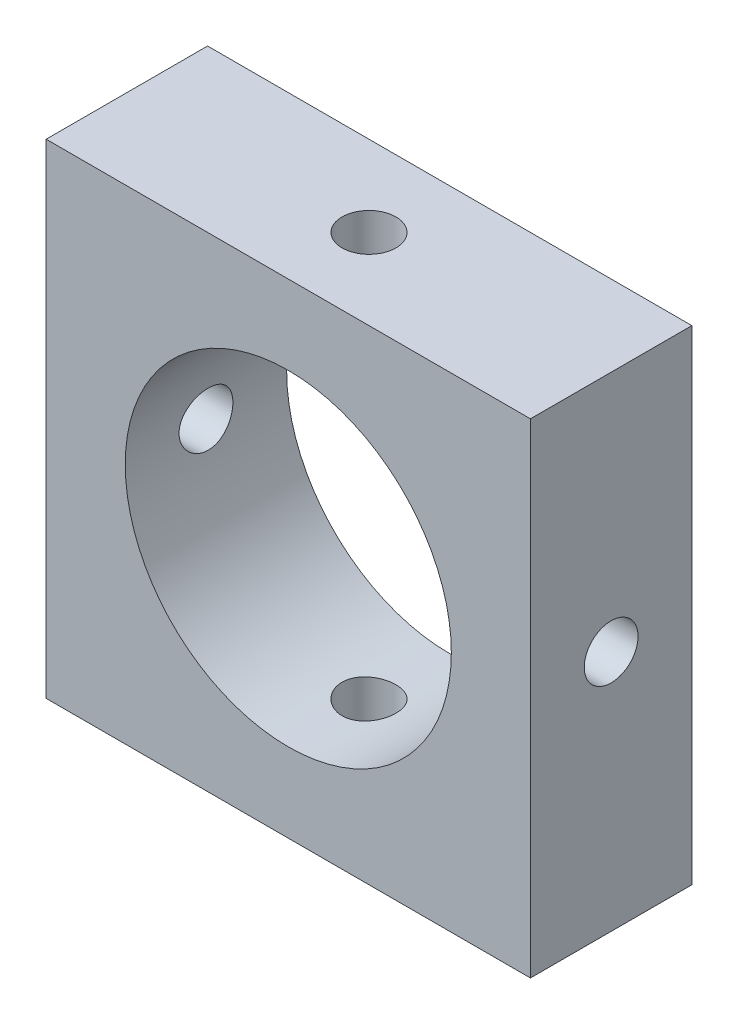
ISO-10303-21;
HEADER;
FILE_DESCRIPTION(('STEP AP214'),'2;1');
FILE_NAME('part.step','',(''),(''),'','','');
FILE_SCHEMA(('AUTOMOTIVE_DESIGN { 1 0 10303 214 1 1 1 1 }'));
ENDSEC;
DATA;
#1=APPLICATION_CONTEXT('core data for automotive mechanical design processes');
#2=APPLICATION_PROTOCOL_DEFINITION('international standard','automotive_design',2000,#1);
#3=PRODUCT_CONTEXT('',#1,'mechanical');
#4=PRODUCT('Part','Part','',(#3));
#5=PRODUCT_RELATED_PRODUCT_CATEGORY('part','',(#4));
#6=PRODUCT_DEFINITION_FORMATION('','',#4);
#7=PRODUCT_DEFINITION_CONTEXT('part definition',#1,'design');
#8=PRODUCT_DEFINITION('design','',#6,#7);
#9=PRODUCT_DEFINITION_SHAPE('','',#8);
#10=(LENGTH_UNIT() NAMED_UNIT(*) SI_UNIT(.MILLI.,.METRE.));
#11=(NAMED_UNIT(*) PLANE_ANGLE_UNIT() SI_UNIT($,.RADIAN.));
#12=(NAMED_UNIT(*) SI_UNIT($,.STERADIAN.) SOLID_ANGLE_UNIT());
#13=UNCERTAINTY_MEASURE_WITH_UNIT(LENGTH_MEASURE(1.E-05),#10,'distance_accuracy_value','');
#14=(GEOMETRIC_REPRESENTATION_CONTEXT(3) GLOBAL_UNCERTAINTY_ASSIGNED_CONTEXT((#13)) GLOBAL_UNIT_ASSIGNED_CONTEXT((#10,
#11,#12)) REPRESENTATION_CONTEXT('',''));
#15=CARTESIAN_POINT('',(0.,0.,0.));
#16=DIRECTION('',(0.,0.,1.));
#17=DIRECTION('',(1.,0.,0.));
#18=AXIS2_PLACEMENT_3D('',#15,#16,#17);
#19=CARTESIAN_POINT('',(0.,0.,19.05));
#20=DIRECTION('',(1.,0.,0.));
#21=DIRECTION('',(0.,0.,-1.));
#22=AXIS2_PLACEMENT_3D('',#19,#20,#21);
#23=PLANE('',#22);
#24=CARTESIAN_POINT('',(0.,28.575,9.525));
#25=DIRECTION('',(1.,0.,0.));
#26=DIRECTION('',(0.,0.,-1.));
#27=AXIS2_PLACEMENT_3D('',#24,#25,#26);
#28=CIRCLE('',#27,3.175);
#29=CARTESIAN_POINT('',(0.,28.575,6.35));
#30=VERTEX_POINT('',#29);
#31=EDGE_CURVE('E118',#30,#30,#28,.T.);
#32=ORIENTED_EDGE('',*,*,#31,.T.);
#33=EDGE_LOOP('',(#32));
#34=FACE_BOUND('',#33,.T.);
#35=DIRECTION('',(0.,-1.,0.));
#36=VECTOR('',#35,1.);
#37=CARTESIAN_POINT('',(0.,0.,0.));
#38=LINE('',#37,#36);
#39=CARTESIAN_POINT('',(0.,57.15,0.));
#40=VERTEX_POINT('',#39);
#41=CARTESIAN_POINT('',(0.,0.,0.));
#42=VERTEX_POINT('',#41);
#43=EDGE_CURVE('E102',#40,#42,#38,.T.);
#44=ORIENTED_EDGE('',*,*,#43,.T.);
#45=DIRECTION('',(0.,0.,-1.));
#46=VECTOR('',#45,1.);
#47=CARTESIAN_POINT('',(0.,0.,19.05));
#48=LINE('',#47,#46);
#49=CARTESIAN_POINT('',(0.,0.,19.05));
#50=VERTEX_POINT('',#49);
#51=EDGE_CURVE('E11',#50,#42,#48,.T.);
#52=ORIENTED_EDGE('',*,*,#51,.F.);
#53=DIRECTION('',(0.,-1.,0.));
#54=VECTOR('',#53,1.);
#55=CARTESIAN_POINT('',(0.,0.,19.05));
#56=LINE('',#55,#54);
#57=CARTESIAN_POINT('',(0.,57.15,19.05));
#58=VERTEX_POINT('',#57);
#59=EDGE_CURVE('E89',#58,#50,#56,.T.);
#60=ORIENTED_EDGE('',*,*,#59,.F.);
#61=DIRECTION('',(0.,0.,-1.));
#62=VECTOR('',#61,1.);
#63=CARTESIAN_POINT('',(0.,57.15,19.05));
#64=LINE('',#63,#62);
#65=EDGE_CURVE('E98',#58,#40,#64,.T.);
#66=ORIENTED_EDGE('',*,*,#65,.T.);
#67=EDGE_LOOP('',(#44,#52,#60,#66));
#68=FACE_BOUND('',#67,.T.);
#69=ADVANCED_FACE('F32',(#34,#68),#23,.F.);
#70=CARTESIAN_POINT('',(0.,0.,19.05));
#71=DIRECTION('',(0.,1.,0.));
#72=DIRECTION('',(0.,0.,1.));
#73=AXIS2_PLACEMENT_3D('',#70,#71,#72);
#74=PLANE('',#73);
#75=CARTESIAN_POINT('',(28.575,0.,9.525));
#76=DIRECTION('',(0.,-1.,0.));
#77=DIRECTION('',(0.,0.,-1.));
#78=AXIS2_PLACEMENT_3D('',#75,#76,#77);
#79=CIRCLE('',#78,3.175);
#80=CARTESIAN_POINT('',(28.575,0.,6.35));
#81=VERTEX_POINT('',#80);
#82=EDGE_CURVE('E146',#81,#81,#79,.T.);
#83=ORIENTED_EDGE('',*,*,#82,.F.);
#84=EDGE_LOOP('',(#83));
#85=FACE_BOUND('',#84,.T.);
#86=DIRECTION('',(1.,0.,0.));
#87=VECTOR('',#86,1.);
#88=CARTESIAN_POINT('',(0.,0.,0.));
#89=LINE('',#88,#87);
#90=CARTESIAN_POINT('',(57.15,0.,0.));
#91=VERTEX_POINT('',#90);
#92=EDGE_CURVE('E93',#42,#91,#89,.T.);
#93=ORIENTED_EDGE('',*,*,#92,.T.);
#94=DIRECTION('',(0.,0.,-1.));
#95=VECTOR('',#94,1.);
#96=CARTESIAN_POINT('',(57.15,0.,19.05));
#97=LINE('',#96,#95);
#98=CARTESIAN_POINT('',(57.15,0.,19.05));
#99=VERTEX_POINT('',#98);
#100=EDGE_CURVE('E45',#99,#91,#97,.T.);
#101=ORIENTED_EDGE('',*,*,#100,.F.);
#102=DIRECTION('',(1.,0.,0.));
#103=VECTOR('',#102,1.);
#104=CARTESIAN_POINT('',(0.,0.,19.05));
#105=LINE('',#104,#103);
#106=EDGE_CURVE('E84',#50,#99,#105,.T.);
#107=ORIENTED_EDGE('',*,*,#106,.F.);
#108=ORIENTED_EDGE('',*,*,#51,.T.);
#109=EDGE_LOOP('',(#93,#101,#107,#108));
#110=FACE_BOUND('',#109,.T.);
#111=ADVANCED_FACE('F92',(#85,#110),#74,.F.);
#112=CARTESIAN_POINT('',(57.15,0.,19.05));
#113=DIRECTION('',(-1.,0.,0.));
#114=DIRECTION('',(0.,0.,1.));
#115=AXIS2_PLACEMENT_3D('',#112,#113,#114);
#116=PLANE('',#115);
#117=CARTESIAN_POINT('',(57.15,28.575,9.525));
#118=DIRECTION('',(1.,0.,0.));
#119=DIRECTION('',(0.,0.,-1.));
#120=AXIS2_PLACEMENT_3D('',#117,#118,#119);
#121=CIRCLE('',#120,3.175);
#122=CARTESIAN_POINT('',(57.15,28.575,6.35));
#123=VERTEX_POINT('',#122);
#124=EDGE_CURVE('E144',#123,#123,#121,.T.);
#125=ORIENTED_EDGE('',*,*,#124,.F.);
#126=EDGE_LOOP('',(#125));
#127=FACE_BOUND('',#126,.T.);
#128=DIRECTION('',(0.,1.,0.));
#129=VECTOR('',#128,1.);
#130=CARTESIAN_POINT('',(57.15,0.,0.));
#131=LINE('',#130,#129);
#132=CARTESIAN_POINT('',(57.15,57.15,0.));
#133=VERTEX_POINT('',#132);
#134=EDGE_CURVE('E71',#91,#133,#131,.T.);
#135=ORIENTED_EDGE('',*,*,#134,.T.);
#136=DIRECTION('',(0.,0.,-1.));
#137=VECTOR('',#136,1.);
#138=CARTESIAN_POINT('',(57.15,57.15,19.05));
#139=LINE('',#138,#137);
#140=CARTESIAN_POINT('',(57.15,57.15,19.05));
#141=VERTEX_POINT('',#140);
#142=EDGE_CURVE('E94',#141,#133,#139,.T.);
#143=ORIENTED_EDGE('',*,*,#142,.F.);
#144=DIRECTION('',(0.,1.,0.));
#145=VECTOR('',#144,1.);
#146=CARTESIAN_POINT('',(57.15,0.,19.05));
#147=LINE('',#146,#145);
#148=EDGE_CURVE('E87',#99,#141,#147,.T.);
#149=ORIENTED_EDGE('',*,*,#148,.F.);
#150=ORIENTED_EDGE('',*,*,#100,.T.);
#151=EDGE_LOOP('',(#135,#143,#149,#150));
#152=FACE_BOUND('',#151,.T.);
#153=ADVANCED_FACE('F96',(#127,#152),#116,.F.);
#154=CARTESIAN_POINT('',(0.,57.15,19.05));
#155=DIRECTION('',(0.,-1.,0.));
#156=DIRECTION('',(0.,0.,-1.));
#157=AXIS2_PLACEMENT_3D('',#154,#155,#156);
#158=PLANE('',#157);
#159=CARTESIAN_POINT('',(28.575,57.15,9.525));
#160=DIRECTION('',(0.,-1.,0.));
#161=DIRECTION('',(0.,0.,-1.));
#162=AXIS2_PLACEMENT_3D('',#159,#160,#161);
#163=CIRCLE('',#162,3.175);
#164=CARTESIAN_POINT('',(28.575,57.15,6.35));
#165=VERTEX_POINT('',#164);
#166=EDGE_CURVE('E140',#165,#165,#163,.T.);
#167=ORIENTED_EDGE('',*,*,#166,.T.);
#168=EDGE_LOOP('',(#167));
#169=FACE_BOUND('',#168,.T.);
#170=DIRECTION('',(-1.,0.,0.));
#171=VECTOR('',#170,1.);
#172=CARTESIAN_POINT('',(0.,57.15,0.));
#173=LINE('',#172,#171);
#174=EDGE_CURVE('E77',#133,#40,#173,.T.);
#175=ORIENTED_EDGE('',*,*,#174,.T.);
#176=ORIENTED_EDGE('',*,*,#65,.F.);
#177=DIRECTION('',(-1.,0.,0.));
#178=VECTOR('',#177,1.);
#179=CARTESIAN_POINT('',(0.,57.15,19.05));
#180=LINE('',#179,#178);
#181=EDGE_CURVE('E54',#141,#58,#180,.T.);
#182=ORIENTED_EDGE('',*,*,#181,.F.);
#183=ORIENTED_EDGE('',*,*,#142,.T.);
#184=EDGE_LOOP('',(#175,#176,#182,#183));
#185=FACE_BOUND('',#184,.T.);
#186=ADVANCED_FACE('F176',(#169,#185),#158,.F.);
#187=CARTESIAN_POINT('',(0.,57.15,19.05));
#188=DIRECTION('',(0.,0.,-1.));
#189=DIRECTION('',(-1.,0.,0.));
#190=AXIS2_PLACEMENT_3D('',#187,#188,#189);
#191=PLANE('',#190);
#192=CARTESIAN_POINT('',(28.575,28.575,19.05));
#193=DIRECTION('',(0.,0.,-1.));
#194=DIRECTION('',(-1.,0.,0.));
#195=AXIS2_PLACEMENT_3D('',#192,#193,#194);
#196=CIRCLE('',#195,19.2405);
#197=CARTESIAN_POINT('',(9.3345,28.575,19.05));
#198=VERTEX_POINT('',#197);
#199=EDGE_CURVE('E105',#198,#198,#196,.T.);
#200=ORIENTED_EDGE('',*,*,#199,.T.);
#201=EDGE_LOOP('',(#200));
#202=FACE_BOUND('',#201,.T.);
#203=ORIENTED_EDGE('',*,*,#59,.T.);
#204=ORIENTED_EDGE('',*,*,#106,.T.);
#205=ORIENTED_EDGE('',*,*,#148,.T.);
#206=ORIENTED_EDGE('',*,*,#181,.T.);
#207=EDGE_LOOP('',(#203,#204,#205,#206));
#208=FACE_BOUND('',#207,.T.);
#209=ADVANCED_FACE('F85',(#202,#208),#191,.F.);
#210=CARTESIAN_POINT('',(0.,57.15,0.));
#211=DIRECTION('',(0.,0.,-1.));
#212=DIRECTION('',(-1.,0.,0.));
#213=AXIS2_PLACEMENT_3D('',#210,#211,#212);
#214=PLANE('',#213);
#215=CARTESIAN_POINT('',(28.575,28.575,0.));
#216=DIRECTION('',(0.,0.,-1.));
#217=DIRECTION('',(-1.,0.,0.));
#218=AXIS2_PLACEMENT_3D('',#215,#216,#217);
#219=CIRCLE('',#218,19.2405);
#220=CARTESIAN_POINT('',(9.3345,28.575,0.));
#221=VERTEX_POINT('',#220);
#222=EDGE_CURVE('E159',#221,#221,#219,.T.);
#223=ORIENTED_EDGE('',*,*,#222,.F.);
#224=EDGE_LOOP('',(#223));
#225=FACE_BOUND('',#224,.T.);
#226=ORIENTED_EDGE('',*,*,#43,.F.);
#227=ORIENTED_EDGE('',*,*,#174,.F.);
#228=ORIENTED_EDGE('',*,*,#134,.F.);
#229=ORIENTED_EDGE('',*,*,#92,.F.);
#230=EDGE_LOOP('',(#226,#227,#228,#229));
#231=FACE_BOUND('',#230,.T.);
#232=ADVANCED_FACE('F169',(#225,#231),#214,.T.);
#233=CARTESIAN_POINT('',(28.575,28.575,19.05));
#234=DIRECTION('',(0.,0.,-1.));
#235=DIRECTION('',(-1.,0.,0.));
#236=AXIS2_PLACEMENT_3D('',#233,#234,#235);
#237=CYLINDRICAL_SURFACE('',#236,19.2405);
#238=CARTESIAN_POINT('',(28.575,47.8155,6.35));
#239=CARTESIAN_POINT('',(28.397947913554,47.8154969837344,6.35000712136172));
#240=CARTESIAN_POINT('',(28.2207985666978,47.8130306641657,6.36485983982078));
#241=CARTESIAN_POINT('',(27.8714666111681,47.8034295082057,6.42385457907963));
#242=CARTESIAN_POINT('',(27.6992887514887,47.7962903527383,6.46802369739489));
#243=CARTESIAN_POINT('',(27.3650045778717,47.7781444341037,6.58428276940114));
#244=CARTESIAN_POINT('',(27.202890213417,47.7671408105738,6.65635006242562));
#245=CARTESIAN_POINT('',(26.8930757490541,47.7424764592897,6.82630082904993));
#246=CARTESIAN_POINT('',(26.7453739669883,47.7288160421803,6.92418128492947));
#247=CARTESIAN_POINT('',(26.4671709013988,47.7002096764282,7.1439566888027));
#248=CARTESIAN_POINT('',(26.3368244134482,47.6852538991267,7.26604632653844));
#249=CARTESIAN_POINT('',(26.0983689628591,47.6558178261998,7.53035537302384));
#250=CARTESIAN_POINT('',(25.9902613906811,47.6413375603527,7.67257603950305));
#251=CARTESIAN_POINT('',(25.7987340291929,47.6143968066291,7.97417095866139));
#252=CARTESIAN_POINT('',(25.7154669697693,47.6019490187602,8.13364343560429));
#253=CARTESIAN_POINT('',(25.5769608984537,47.5806187326049,8.46455136786007));
#254=CARTESIAN_POINT('',(25.5217200315902,47.5717359983663,8.63598603057636));
#255=CARTESIAN_POINT('',(25.4413214264075,47.558639260818,8.98431238133993));
#256=CARTESIAN_POINT('',(25.4158966733169,47.5543838435553,9.16114085217492));
#257=CARTESIAN_POINT('',(25.395024202774,47.5508982255772,9.51660135890357));
#258=CARTESIAN_POINT('',(25.3995744055364,47.5516676762159,9.69523326880856));
#259=CARTESIAN_POINT('',(25.4383051169505,47.5581070386683,10.0473259122354));
#260=CARTESIAN_POINT('',(25.4721859378572,47.5637273843637,10.2208206501619));
#261=CARTESIAN_POINT('',(25.5681459425509,47.5791576932372,10.5596288488598));
#262=CARTESIAN_POINT('',(25.6302260760636,47.5889677975216,10.7249420338763));
#263=CARTESIAN_POINT('',(25.7811271312062,47.6117259390841,11.0435931774727));
#264=CARTESIAN_POINT('',(25.8700727566253,47.6246885537526,11.196870997181));
#265=CARTESIAN_POINT('',(26.0720913889211,47.6522809918125,11.4864395749954));
#266=CARTESIAN_POINT('',(26.1851663056027,47.6669109471293,11.6227289871355));
#267=CARTESIAN_POINT('',(26.4338678451888,47.6964075540272,11.8761869474929));
#268=CARTESIAN_POINT('',(26.5697516512705,47.7112749225227,11.9931032024143));
#269=CARTESIAN_POINT('',(26.8593432215965,47.7394068735723,12.2025128962548));
#270=CARTESIAN_POINT('',(27.0130510965173,47.752671446173,12.2950061835107));
#271=CARTESIAN_POINT('',(27.3341629037927,47.7761215469079,12.4529663203934));
#272=CARTESIAN_POINT('',(27.501577850558,47.7863045673667,12.5184111745658));
#273=CARTESIAN_POINT('',(27.8452284377131,47.8024239944305,12.6201841017672));
#274=CARTESIAN_POINT('',(28.0214633536635,47.8083607491973,12.6565145619871));
#275=CARTESIAN_POINT('',(28.3755763794778,47.8152719895203,12.6986860742709));
#276=CARTESIAN_POINT('',(28.5534121748664,47.8163028497357,12.7048735256011));
#277=CARTESIAN_POINT('',(28.9075796812303,47.8134404584724,12.6875064744931));
#278=CARTESIAN_POINT('',(29.0839114486469,47.8095473925987,12.6639530931206));
#279=CARTESIAN_POINT('',(29.4289976703936,47.7973094800832,12.5880610783763));
#280=CARTESIAN_POINT('',(29.597790798639,47.788991121157,12.5358936580621));
#281=CARTESIAN_POINT('',(29.9242353410509,47.7688316888029,12.4044367225813));
#282=CARTESIAN_POINT('',(30.0818861392379,47.7569904208069,12.325145709359));
#283=CARTESIAN_POINT('',(30.3830774503878,47.7309591802733,12.1408970095784));
#284=CARTESIAN_POINT('',(30.5264836675823,47.7167497206736,12.0357225957687));
#285=CARTESIAN_POINT('',(30.7937346720495,47.6876178733248,11.8029911146548));
#286=CARTESIAN_POINT('',(30.9175780669818,47.6726954349294,11.6754324555641));
#287=CARTESIAN_POINT('',(31.1434695571079,47.6436375597009,11.4000009856216));
#288=CARTESIAN_POINT('',(31.2452837960394,47.6295116426904,11.2519352184597));
#289=CARTESIAN_POINT('',(31.4225943951837,47.6038230497591,10.9405988333899));
#290=CARTESIAN_POINT('',(31.4980915776252,47.5922602937611,10.7773286907171));
#291=CARTESIAN_POINT('',(31.6202739056589,47.5730783776699,10.4408765625623));
#292=CARTESIAN_POINT('',(31.6670761406546,47.5654432119196,10.267738051668));
#293=CARTESIAN_POINT('',(31.7309089389331,47.5549405565368,9.91592082394799));
#294=CARTESIAN_POINT('',(31.7479420345794,47.5520726613691,9.73724257968537));
#295=CARTESIAN_POINT('',(31.7516834937131,47.5514465002341,9.38175266859036));
#296=CARTESIAN_POINT('',(31.7387599149304,47.5536262172909,9.20494487667943));
#297=CARTESIAN_POINT('',(31.6837500019711,47.5627138803053,8.8560559613459));
#298=CARTESIAN_POINT('',(31.641663756995,47.5696218118005,8.68397482346745));
#299=CARTESIAN_POINT('',(31.5296630776218,47.5873641804121,8.34956213916771));
#300=CARTESIAN_POINT('',(31.4597797180792,47.5981942317193,8.18721993786637));
#301=CARTESIAN_POINT('',(31.2942062209368,47.6225649232224,7.87650452297841));
#302=CARTESIAN_POINT('',(31.1985148448117,47.6361056934974,7.7281319802561));
#303=CARTESIAN_POINT('',(30.9827256235976,47.6645690209393,7.44770700915633));
#304=CARTESIAN_POINT('',(30.8623568088921,47.6795058199459,7.31586451032861));
#305=CARTESIAN_POINT('',(30.6012010914436,47.7089640660739,7.07412280290018));
#306=CARTESIAN_POINT('',(30.4604094802393,47.7234854164871,6.96422866840416));
#307=CARTESIAN_POINT('',(30.1612751334186,47.7505901456905,6.76882601559133));
#308=CARTESIAN_POINT('',(30.0028202371091,47.763159767167,6.68348728150519));
#309=CARTESIAN_POINT('',(29.6736824625045,47.7848108216127,6.5407694863145));
#310=CARTESIAN_POINT('',(29.5030120100844,47.7938957410872,6.48336246351765));
#311=CARTESIAN_POINT('',(29.2055562578312,47.8055617658228,6.41065633922736));
#312=CARTESIAN_POINT('',(29.0805743547458,47.8092687642808,6.38794646756264));
#313=CARTESIAN_POINT('',(28.8287449343358,47.8142389419024,6.35761587176918));
#314=CARTESIAN_POINT('',(28.7018974481657,47.8155021618294,6.34999489595041));
#315=CARTESIAN_POINT('',(28.575,47.8155,6.35));
#316=B_SPLINE_CURVE_WITH_KNOTS('',3,(#238,#239,#240,#241,#242,#243,#244,#245,#246,#247,#248,
#249,#250,#251,#252,#253,#254,#255,#256,#257,#258,#259,#260,#261,#262,#263,#264,#265,#266,#267,
#268,#269,#270,#271,#272,#273,#274,#275,#276,#277,#278,#279,#280,#281,#282,#283,#284,#285,#286,
#287,#288,#289,#290,#291,#292,#293,#294,#295,#296,#297,#298,#299,#300,#301,#302,#303,#304,#305,
#306,#307,#308,#309,#310,#311,#312,#313,#314,#315),.UNSPECIFIED.,.T.,.F.,(4,2,2,2,2,2,2,2,2,2,2,
2,2,2,2,2,2,2,2,2,2,2,2,2,2,2,2,2,2,2,2,2,2,2,2,2,2,2,4),(0.,0.530692427874736,1.06187606578621,
1.59262914493089,2.12332020320333,2.65846608806392,3.1936454220902,3.73205048047841,
4.27041989876375,4.8039302750383,5.33740363456921,5.86548967617764,6.39359350453474,
6.92418736446493,7.45482323586189,7.99190291287789,8.52898592500826,9.06650483119594,
9.60397965981713,10.1352630917325,10.6665264977851,11.1946452100801,11.7227930954675,
12.2555234455154,12.7882916943971,13.3264648082845,13.8646211064194,14.4005665893582,
14.9364664789442,15.4658170800842,15.9951660620939,16.5239249318311,17.0527091811941,
17.5876447481676,18.1227038407544,18.6613781865837,19.1995121646632,19.579878414846,
19.9602383202835),.UNSPECIFIED.);
#317=CARTESIAN_POINT('',(28.575,47.8155,6.35));
#318=VERTEX_POINT('',#317);
#319=EDGE_CURVE('E35',#318,#318,#316,.T.);
#320=ORIENTED_EDGE('',*,*,#319,.T.);
#321=EDGE_LOOP('',(#320));
#322=FACE_BOUND('',#321,.T.);
#323=CARTESIAN_POINT('',(28.575,9.33449999999999,6.35));
#324=CARTESIAN_POINT('',(28.752052086446,9.33450301626555,6.35000712136172));
#325=CARTESIAN_POINT('',(28.9292014333022,9.33696933583425,6.36485983982078));
#326=CARTESIAN_POINT('',(29.2785333888319,9.34657049179427,6.42385457907963));
#327=CARTESIAN_POINT('',(29.4507112485113,9.35370964726167,6.46802369739489));
#328=CARTESIAN_POINT('',(29.7849954221283,9.37185556589626,6.58428276940114));
#329=CARTESIAN_POINT('',(29.947109786583,9.3828591894262,6.65635006242562));
#330=CARTESIAN_POINT('',(30.2569242509459,9.40752354071033,6.82630082904993));
#331=CARTESIAN_POINT('',(30.4046260330117,9.42118395781974,6.92418128492947));
#332=CARTESIAN_POINT('',(30.6828290986012,9.44979032357182,7.1439566888027));
#333=CARTESIAN_POINT('',(30.8131755865518,9.46474610087328,7.26604632653844));
#334=CARTESIAN_POINT('',(31.0516310371409,9.49418217380018,7.53035537302384));
#335=CARTESIAN_POINT('',(31.1597386093189,9.50866243964732,7.67257603950305));
#336=CARTESIAN_POINT('',(31.3512659708071,9.53560319337089,7.97417095866139));
#337=CARTESIAN_POINT('',(31.4345330302307,9.54805098123983,8.13364343560429));
#338=CARTESIAN_POINT('',(31.5730391015463,9.56938126739506,8.46455136786007));
#339=CARTESIAN_POINT('',(31.6282799684098,9.57826400163369,8.63598603057636));
#340=CARTESIAN_POINT('',(31.7086785735925,9.59136073918201,8.98431238133994));
#341=CARTESIAN_POINT('',(31.7341033266831,9.59561615644471,9.16114085217492));
#342=CARTESIAN_POINT('',(31.754975797226,9.59910177442279,9.51660135890357));
#343=CARTESIAN_POINT('',(31.7504255944636,9.59833232378411,9.69523326880856));
#344=CARTESIAN_POINT('',(31.7116948830495,9.59189296133168,10.0473259122354));
#345=CARTESIAN_POINT('',(31.6778140621428,9.58627261563626,10.2208206501619));
#346=CARTESIAN_POINT('',(31.5818540574491,9.5708423067628,10.5596288488598));
#347=CARTESIAN_POINT('',(31.5197739239364,9.56103220247838,10.7249420338763));
#348=CARTESIAN_POINT('',(31.3688728687938,9.53827406091591,11.0435931774727));
#349=CARTESIAN_POINT('',(31.2799272433747,9.52531144624744,11.196870997181));
#350=CARTESIAN_POINT('',(31.0779086110789,9.49771900818751,11.4864395749954));
#351=CARTESIAN_POINT('',(30.9648336943973,9.48308905287074,11.6227289871355));
#352=CARTESIAN_POINT('',(30.7161321548112,9.45359244597276,11.8761869474929));
#353=CARTESIAN_POINT('',(30.5802483487295,9.43872507747733,11.9931032024143));
#354=CARTESIAN_POINT('',(30.2906567784035,9.41059312642774,12.2025128962548));
#355=CARTESIAN_POINT('',(30.1369489034827,9.39732855382699,12.2950061835107));
#356=CARTESIAN_POINT('',(29.8158370962073,9.37387845309212,12.4529663203934));
#357=CARTESIAN_POINT('',(29.648422149442,9.36369543263325,12.5184111745658));
#358=CARTESIAN_POINT('',(29.3047715622869,9.3475760055695,12.6201841017672));
#359=CARTESIAN_POINT('',(29.1285366463365,9.34163925080273,12.6565145619871));
#360=CARTESIAN_POINT('',(28.7744236205222,9.33472801047972,12.6986860742709));
#361=CARTESIAN_POINT('',(28.5965878251336,9.3336971502643,12.7048735256011));
#362=CARTESIAN_POINT('',(28.2424203187697,9.33655954152755,12.6875064744931));
#363=CARTESIAN_POINT('',(28.0660885513531,9.34045260740134,12.6639530931206));
#364=CARTESIAN_POINT('',(27.7210023296064,9.35269051991678,12.5880610783763));
#365=CARTESIAN_POINT('',(27.552209201361,9.36100887884303,12.5358936580621));
#366=CARTESIAN_POINT('',(27.2257646589491,9.38116831119714,12.4044367225814));
#367=CARTESIAN_POINT('',(27.0681138607621,9.39300957919314,12.325145709359));
#368=CARTESIAN_POINT('',(26.7669225496122,9.41904081972665,12.1408970095784));
#369=CARTESIAN_POINT('',(26.6235163324177,9.43325027932643,12.0357225957687));
#370=CARTESIAN_POINT('',(26.3562653279505,9.46238212667524,11.8029911146548));
#371=CARTESIAN_POINT('',(26.2324219330182,9.4773045650706,11.6754324555641));
#372=CARTESIAN_POINT('',(26.0065304428921,9.50636244029909,11.4000009856216));
#373=CARTESIAN_POINT('',(25.9047162039606,9.52048835730961,11.2519352184597));
#374=CARTESIAN_POINT('',(25.7274056048163,9.54617695024093,10.9405988333899));
#375=CARTESIAN_POINT('',(25.6519084223748,9.55773970623895,10.7773286907171));
#376=CARTESIAN_POINT('',(25.5297260943411,9.57692162233013,10.4408765625623));
#377=CARTESIAN_POINT('',(25.4829238593454,9.58455678808042,10.267738051668));
#378=CARTESIAN_POINT('',(25.4190910610669,9.59505944346324,9.91592082394799));
#379=CARTESIAN_POINT('',(25.4020579654206,9.5979273386309,9.73724257968537));
#380=CARTESIAN_POINT('',(25.3983165062869,9.59855349976594,9.38175266859036));
#381=CARTESIAN_POINT('',(25.4112400850696,9.59637378270912,9.20494487667942));
#382=CARTESIAN_POINT('',(25.4662499980289,9.58728611969473,8.8560559613459));
#383=CARTESIAN_POINT('',(25.508336243005,9.58037818819948,8.68397482346745));
#384=CARTESIAN_POINT('',(25.6203369223782,9.56263581958794,8.34956213916771));
#385=CARTESIAN_POINT('',(25.6902202819208,9.55180576828066,8.18721993786637));
#386=CARTESIAN_POINT('',(25.8557937790632,9.52743507677759,7.87650452297841));
#387=CARTESIAN_POINT('',(25.9514851551883,9.51389430650257,7.72813198025609));
#388=CARTESIAN_POINT('',(26.1672743764024,9.48543097906066,7.44770700915633));
#389=CARTESIAN_POINT('',(26.2876431911079,9.4704941800541,7.31586451032862));
#390=CARTESIAN_POINT('',(26.5487989085564,9.44103593392613,7.07412280290018));
#391=CARTESIAN_POINT('',(26.6895905197607,9.42651458351293,6.96422866840416));
#392=CARTESIAN_POINT('',(26.9887248665814,9.39940985430953,6.76882601559133));
#393=CARTESIAN_POINT('',(27.1471797628909,9.38684023283301,6.6834872815052));
#394=CARTESIAN_POINT('',(27.4763175374955,9.3651891783873,6.5407694863145));
#395=CARTESIAN_POINT('',(27.6469879899156,9.35610425891274,6.48336246351765));
#396=CARTESIAN_POINT('',(27.9444437421688,9.3444382341772,6.41065633922736));
#397=CARTESIAN_POINT('',(28.0694256452542,9.34073123571921,6.38794646756264));
#398=CARTESIAN_POINT('',(28.3212550656642,9.33576105809762,6.35761587176918));
#399=CARTESIAN_POINT('',(28.4481025518343,9.33449783817061,6.34999489595041));
#400=CARTESIAN_POINT('',(28.575,9.33449999999999,6.35));
#401=B_SPLINE_CURVE_WITH_KNOTS('',3,(#323,#324,#325,#326,#327,#328,#329,#330,#331,#332,#333,
#334,#335,#336,#337,#338,#339,#340,#341,#342,#343,#344,#345,#346,#347,#348,#349,#350,#351,#352,
#353,#354,#355,#356,#357,#358,#359,#360,#361,#362,#363,#364,#365,#366,#367,#368,#369,#370,#371,
#372,#373,#374,#375,#376,#377,#378,#379,#380,#381,#382,#383,#384,#385,#386,#387,#388,#389,#390,
#391,#392,#393,#394,#395,#396,#397,#398,#399,#400),.UNSPECIFIED.,.T.,.F.,(4,2,2,2,2,2,2,2,2,2,2,
2,2,2,2,2,2,2,2,2,2,2,2,2,2,2,2,2,2,2,2,2,2,2,2,2,2,2,4),(0.,0.530692427874736,1.06187606578621,
1.5926291449309,2.12332020320333,2.65846608806392,3.19364542209019,3.73205048047842,
4.27041989876375,4.8039302750383,5.33740363456921,5.86548967617764,6.39359350453473,
6.92418736446493,7.45482323586188,7.99190291287789,8.52898592500826,9.06650483119594,
9.60397965981713,10.1352630917325,10.6665264977851,11.19464521008,11.7227930954675,
12.2555234455154,12.7882916943971,13.3264648082845,13.8646211064194,14.4005665893582,
14.9364664789442,15.4658170800842,15.9951660620939,16.5239249318311,17.0527091811941,
17.5876447481676,18.1227038407544,18.6613781865837,19.1995121646632,19.5798784148459,
19.9602383202835),.UNSPECIFIED.);
#402=CARTESIAN_POINT('',(28.575,9.33449999999999,6.35));
#403=VERTEX_POINT('',#402);
#404=EDGE_CURVE('E136',#403,#403,#401,.T.);
#405=ORIENTED_EDGE('',*,*,#404,.T.);
#406=EDGE_LOOP('',(#405));
#407=FACE_BOUND('',#406,.T.);
#408=CARTESIAN_POINT('',(9.3345,28.575,12.7));
#409=CARTESIAN_POINT('',(9.33450301626557,28.752052086446,12.6999928786383));
#410=CARTESIAN_POINT('',(9.33696933583426,28.9292014333022,12.6851401601792));
#411=CARTESIAN_POINT('',(9.34657049179427,29.2785333888319,12.6261454209204));
#412=CARTESIAN_POINT('',(9.35370964726167,29.4507112485113,12.5819763026051));
#413=CARTESIAN_POINT('',(9.37185556589626,29.7849954221283,12.4657172305989));
#414=CARTESIAN_POINT('',(9.3828591894262,29.947109786583,12.3936499375744));
#415=CARTESIAN_POINT('',(9.40752354071033,30.2569242509459,12.2236991709501));
#416=CARTESIAN_POINT('',(9.42118395781974,30.4046260330117,12.1258187150705));
#417=CARTESIAN_POINT('',(9.44979032357181,30.6828290986012,11.9060433111973));
#418=CARTESIAN_POINT('',(9.46474610087328,30.8131755865518,11.7839536734616));
#419=CARTESIAN_POINT('',(9.49418217380018,31.0516310371409,11.5196446269762));
#420=CARTESIAN_POINT('',(9.50866243964732,31.1597386093189,11.377423960497));
#421=CARTESIAN_POINT('',(9.5356031933709,31.3512659708071,11.0758290413386));
#422=CARTESIAN_POINT('',(9.54805098123983,31.4345330302307,10.9163565643957));
#423=CARTESIAN_POINT('',(9.56938126739507,31.5730391015463,10.5854486321399));
#424=CARTESIAN_POINT('',(9.57826400163369,31.6282799684098,10.4140139694236));
#425=CARTESIAN_POINT('',(9.59136073918201,31.7086785735925,10.0656876186601));
#426=CARTESIAN_POINT('',(9.59561615644472,31.7341033266831,9.88885914782507));
#427=CARTESIAN_POINT('',(9.5991017744228,31.754975797226,9.53339864109643));
#428=CARTESIAN_POINT('',(9.59833232378411,31.7504255944636,9.35476673119143));
#429=CARTESIAN_POINT('',(9.59189296133167,31.7116948830495,9.00267408776463));
#430=CARTESIAN_POINT('',(9.58627261563626,31.6778140621428,8.82917934983808));
#431=CARTESIAN_POINT('',(9.5708423067628,31.5818540574491,8.49037115114024));
#432=CARTESIAN_POINT('',(9.56103220247838,31.5197739239364,8.32505796612374));
#433=CARTESIAN_POINT('',(9.53827406091591,31.3688728687938,8.00640682252728));
#434=CARTESIAN_POINT('',(9.52531144624744,31.2799272433747,7.85312900281895));
#435=CARTESIAN_POINT('',(9.49771900818751,31.0779086110789,7.5635604250046));
#436=CARTESIAN_POINT('',(9.48308905287074,30.9648336943973,7.42727101286446));
#437=CARTESIAN_POINT('',(9.45359244597276,30.7161321548112,7.17381305250708));
#438=CARTESIAN_POINT('',(9.43872507747733,30.5802483487295,7.05689679758575));
#439=CARTESIAN_POINT('',(9.41059312642774,30.2906567784035,6.84748710374519));
#440=CARTESIAN_POINT('',(9.397328553827,30.1369489034827,6.75499381648932));
#441=CARTESIAN_POINT('',(9.37387845309212,29.8158370962073,6.59703367960664));
#442=CARTESIAN_POINT('',(9.36369543263325,29.648422149442,6.53158882543416));
#443=CARTESIAN_POINT('',(9.3475760055695,29.3047715622869,6.4298158982328));
#444=CARTESIAN_POINT('',(9.34163925080273,29.1285366463365,6.39348543801289));
#445=CARTESIAN_POINT('',(9.33472801047972,28.7744236205222,6.35131392572906));
#446=CARTESIAN_POINT('',(9.3336971502643,28.5965878251336,6.34512647439888));
#447=CARTESIAN_POINT('',(9.33655954152755,28.2424203187697,6.36249352550688));
#448=CARTESIAN_POINT('',(9.34045260740134,28.0660885513531,6.3860469068794));
#449=CARTESIAN_POINT('',(9.35269051991678,27.7210023296064,6.46193892162366));
#450=CARTESIAN_POINT('',(9.36100887884302,27.552209201361,6.5141063419379));
#451=CARTESIAN_POINT('',(9.38116831119714,27.2257646589491,6.64556327741865));
#452=CARTESIAN_POINT('',(9.39300957919314,27.0681138607621,6.72485429064098));
#453=CARTESIAN_POINT('',(9.41904081972666,26.7669225496122,6.90910299042163));
#454=CARTESIAN_POINT('',(9.43325027932643,26.6235163324177,7.01427740423126));
#455=CARTESIAN_POINT('',(9.46238212667524,26.3562653279505,7.2470088853452));
#456=CARTESIAN_POINT('',(9.4773045650706,26.2324219330182,7.37456754443587));
#457=CARTESIAN_POINT('',(9.50636244029909,26.0065304428921,7.64999901437841));
#458=CARTESIAN_POINT('',(9.52048835730961,25.9047162039606,7.79806478154026));
#459=CARTESIAN_POINT('',(9.54617695024093,25.7274056048163,8.10940116661011));
#460=CARTESIAN_POINT('',(9.55773970623895,25.6519084223748,8.27267130928292));
#461=CARTESIAN_POINT('',(9.57692162233014,25.5297260943411,8.60912343743772));
#462=CARTESIAN_POINT('',(9.58455678808042,25.4829238593454,8.78226194833196));
#463=CARTESIAN_POINT('',(9.59505944346324,25.4190910610669,9.13407917605201));
#464=CARTESIAN_POINT('',(9.5979273386309,25.4020579654206,9.31275742031463));
#465=CARTESIAN_POINT('',(9.59855349976594,25.3983165062869,9.66824733140964));
#466=CARTESIAN_POINT('',(9.59637378270912,25.4112400850696,9.84505512332058));
#467=CARTESIAN_POINT('',(9.58728611969473,25.4662499980289,10.1939440386541));
#468=CARTESIAN_POINT('',(9.58037818819948,25.508336243005,10.3660251765326));
#469=CARTESIAN_POINT('',(9.56263581958793,25.6203369223782,10.7004378608323));
#470=CARTESIAN_POINT('',(9.55180576828066,25.6902202819208,10.8627800621336));
#471=CARTESIAN_POINT('',(9.52743507677759,25.8557937790632,11.1734954770216));
#472=CARTESIAN_POINT('',(9.51389430650257,25.9514851551883,11.3218680197439));
#473=CARTESIAN_POINT('',(9.48543097906066,26.1672743764024,11.6022929908437));
#474=CARTESIAN_POINT('',(9.4704941800541,26.2876431911079,11.7341354896714));
#475=CARTESIAN_POINT('',(9.44103593392613,26.5487989085564,11.9758771970998));
#476=CARTESIAN_POINT('',(9.42651458351293,26.6895905197607,12.0857713315958));
#477=CARTESIAN_POINT('',(9.39940985430953,26.9887248665814,12.2811739844087));
#478=CARTESIAN_POINT('',(9.38684023283301,27.1471797628909,12.3665127184948));
#479=CARTESIAN_POINT('',(9.36518917838731,27.4763175374955,12.5092305136855));
#480=CARTESIAN_POINT('',(9.35610425891275,27.6469879899156,12.5666375364824));
#481=CARTESIAN_POINT('',(9.3444382341772,27.9444437421688,12.6393436607726));
#482=CARTESIAN_POINT('',(9.34073123571921,28.0694256452542,12.6620535324374));
#483=CARTESIAN_POINT('',(9.33576105809762,28.3212550656642,12.6923841282308));
#484=CARTESIAN_POINT('',(9.33449783817062,28.4481025518343,12.7000051040496));
#485=CARTESIAN_POINT('',(9.3345,28.575,12.7));
#486=B_SPLINE_CURVE_WITH_KNOTS('',3,(#408,#409,#410,#411,#412,#413,#414,#415,#416,#417,#418,
#419,#420,#421,#422,#423,#424,#425,#426,#427,#428,#429,#430,#431,#432,#433,#434,#435,#436,#437,
#438,#439,#440,#441,#442,#443,#444,#445,#446,#447,#448,#449,#450,#451,#452,#453,#454,#455,#456,
#457,#458,#459,#460,#461,#462,#463,#464,#465,#466,#467,#468,#469,#470,#471,#472,#473,#474,#475,
#476,#477,#478,#479,#480,#481,#482,#483,#484,#485),.UNSPECIFIED.,.T.,.F.,(4,2,2,2,2,2,2,2,2,2,2,
2,2,2,2,2,2,2,2,2,2,2,2,2,2,2,2,2,2,2,2,2,2,2,2,2,2,2,4),(0.,0.530692427874736,1.06187606578621,
1.5926291449309,2.12332020320334,2.65846608806392,3.19364542209019,3.73205048047842,
4.27041989876375,4.8039302750383,5.33740363456921,5.86548967617764,6.39359350453473,
6.92418736446493,7.45482323586188,7.99190291287789,8.52898592500826,9.06650483119594,
9.60397965981713,10.1352630917325,10.6665264977851,11.19464521008,11.7227930954675,
12.2555234455154,12.7882916943971,13.3264648082845,13.8646211064194,14.4005665893582,
14.9364664789442,15.4658170800842,15.9951660620939,16.5239249318311,17.0527091811941,
17.5876447481676,18.1227038407544,18.6613781865837,19.1995121646632,19.5798784148459,
19.9602383202835),.UNSPECIFIED.);
#487=CARTESIAN_POINT('',(9.3345,28.575,12.7));
#488=VERTEX_POINT('',#487);
#489=EDGE_CURVE('E117',#488,#488,#486,.T.);
#490=ORIENTED_EDGE('',*,*,#489,.T.);
#491=EDGE_LOOP('',(#490));
#492=FACE_BOUND('',#491,.T.);
#493=CARTESIAN_POINT('',(47.8155,28.575,6.35));
#494=CARTESIAN_POINT('',(47.8154969837344,28.752052086446,6.35000712136172));
#495=CARTESIAN_POINT('',(47.8130306641657,28.9292014333022,6.36485983982078));
#496=CARTESIAN_POINT('',(47.8034295082057,29.2785333888319,6.42385457907964));
#497=CARTESIAN_POINT('',(47.7962903527383,29.4507112485113,6.46802369739489));
#498=CARTESIAN_POINT('',(47.7781444341037,29.7849954221283,6.58428276940114));
#499=CARTESIAN_POINT('',(47.7671408105738,29.947109786583,6.65635006242562));
#500=CARTESIAN_POINT('',(47.7424764592897,30.2569242509459,6.82630082904993));
#501=CARTESIAN_POINT('',(47.7288160421803,30.4046260330117,6.92418128492947));
#502=CARTESIAN_POINT('',(47.7002096764282,30.6828290986012,7.1439566888027));
#503=CARTESIAN_POINT('',(47.6852538991267,30.8131755865518,7.26604632653844));
#504=CARTESIAN_POINT('',(47.6558178261998,31.0516310371409,7.53035537302384));
#505=CARTESIAN_POINT('',(47.6413375603527,31.1597386093189,7.67257603950305));
#506=CARTESIAN_POINT('',(47.6143968066291,31.3512659708071,7.97417095866139));
#507=CARTESIAN_POINT('',(47.6019490187602,31.4345330302307,8.13364343560429));
#508=CARTESIAN_POINT('',(47.5806187326049,31.5730391015463,8.46455136786007));
#509=CARTESIAN_POINT('',(47.5717359983663,31.6282799684098,8.63598603057636));
#510=CARTESIAN_POINT('',(47.558639260818,31.7086785735925,8.98431238133994));
#511=CARTESIAN_POINT('',(47.5543838435553,31.7341033266831,9.16114085217493));
#512=CARTESIAN_POINT('',(47.5508982255772,31.754975797226,9.51660135890357));
#513=CARTESIAN_POINT('',(47.5516676762159,31.7504255944636,9.69523326880857));
#514=CARTESIAN_POINT('',(47.5581070386683,31.7116948830495,10.0473259122354));
#515=CARTESIAN_POINT('',(47.5637273843637,31.6778140621428,10.2208206501619));
#516=CARTESIAN_POINT('',(47.5791576932372,31.5818540574491,10.5596288488598));
#517=CARTESIAN_POINT('',(47.5889677975216,31.5197739239364,10.7249420338763));
#518=CARTESIAN_POINT('',(47.6117259390841,31.3688728687938,11.0435931774727));
#519=CARTESIAN_POINT('',(47.6246885537526,31.2799272433747,11.196870997181));
#520=CARTESIAN_POINT('',(47.6522809918125,31.0779086110789,11.4864395749954));
#521=CARTESIAN_POINT('',(47.6669109471293,30.9648336943972,11.6227289871355));
#522=CARTESIAN_POINT('',(47.6964075540272,30.7161321548111,11.8761869474929));
#523=CARTESIAN_POINT('',(47.7112749225227,30.5802483487295,11.9931032024143));
#524=CARTESIAN_POINT('',(47.7394068735723,30.2906567784035,12.2025128962548));
#525=CARTESIAN_POINT('',(47.752671446173,30.1369489034827,12.2950061835107));
#526=CARTESIAN_POINT('',(47.7761215469079,29.8158370962073,12.4529663203934));
#527=CARTESIAN_POINT('',(47.7863045673667,29.648422149442,12.5184111745658));
#528=CARTESIAN_POINT('',(47.8024239944305,29.3047715622869,12.6201841017672));
#529=CARTESIAN_POINT('',(47.8083607491973,29.1285366463365,12.6565145619871));
#530=CARTESIAN_POINT('',(47.8152719895203,28.7744236205222,12.6986860742709));
#531=CARTESIAN_POINT('',(47.8163028497357,28.5965878251336,12.7048735256011));
#532=CARTESIAN_POINT('',(47.8134404584724,28.2424203187697,12.6875064744931));
#533=CARTESIAN_POINT('',(47.8095473925987,28.0660885513531,12.6639530931206));
#534=CARTESIAN_POINT('',(47.7973094800832,27.7210023296064,12.5880610783763));
#535=CARTESIAN_POINT('',(47.788991121157,27.552209201361,12.5358936580621));
#536=CARTESIAN_POINT('',(47.7688316888029,27.2257646589491,12.4044367225814));
#537=CARTESIAN_POINT('',(47.7569904208069,27.0681138607621,12.325145709359));
#538=CARTESIAN_POINT('',(47.7309591802733,26.7669225496122,12.1408970095784));
#539=CARTESIAN_POINT('',(47.7167497206736,26.6235163324177,12.0357225957687));
#540=CARTESIAN_POINT('',(47.6876178733248,26.3562653279505,11.8029911146548));
#541=CARTESIAN_POINT('',(47.6726954349294,26.2324219330182,11.6754324555641));
#542=CARTESIAN_POINT('',(47.6436375597009,26.0065304428921,11.4000009856216));
#543=CARTESIAN_POINT('',(47.6295116426904,25.9047162039606,11.2519352184597));
#544=CARTESIAN_POINT('',(47.6038230497591,25.7274056048163,10.9405988333899));
#545=CARTESIAN_POINT('',(47.5922602937611,25.6519084223748,10.7773286907171));
#546=CARTESIAN_POINT('',(47.5730783776699,25.5297260943411,10.4408765625623));
#547=CARTESIAN_POINT('',(47.5654432119196,25.4829238593454,10.267738051668));
#548=CARTESIAN_POINT('',(47.5549405565368,25.4190910610669,9.91592082394799));
#549=CARTESIAN_POINT('',(47.5520726613691,25.4020579654206,9.73724257968537));
#550=CARTESIAN_POINT('',(47.5514465002341,25.3983165062869,9.38175266859036));
#551=CARTESIAN_POINT('',(47.5536262172909,25.4112400850696,9.20494487667942));
#552=CARTESIAN_POINT('',(47.5627138803053,25.4662499980289,8.8560559613459));
#553=CARTESIAN_POINT('',(47.5696218118005,25.508336243005,8.68397482346745));
#554=CARTESIAN_POINT('',(47.5873641804121,25.6203369223782,8.34956213916771));
#555=CARTESIAN_POINT('',(47.5981942317193,25.6902202819208,8.18721993786637));
#556=CARTESIAN_POINT('',(47.6225649232224,25.8557937790632,7.87650452297842));
#557=CARTESIAN_POINT('',(47.6361056934974,25.9514851551883,7.7281319802561));
#558=CARTESIAN_POINT('',(47.6645690209393,26.1672743764024,7.44770700915633));
#559=CARTESIAN_POINT('',(47.6795058199459,26.2876431911079,7.31586451032861));
#560=CARTESIAN_POINT('',(47.7089640660739,26.5487989085564,7.07412280290018));
#561=CARTESIAN_POINT('',(47.7234854164871,26.6895905197607,6.96422866840416));
#562=CARTESIAN_POINT('',(47.7505901456905,26.9887248665814,6.76882601559133));
#563=CARTESIAN_POINT('',(47.763159767167,27.1471797628909,6.68348728150519));
#564=CARTESIAN_POINT('',(47.7848108216127,27.4763175374955,6.5407694863145));
#565=CARTESIAN_POINT('',(47.7938957410872,27.6469879899156,6.48336246351765));
#566=CARTESIAN_POINT('',(47.8055617658228,27.9444437421688,6.41065633922736));
#567=CARTESIAN_POINT('',(47.8092687642808,28.0694256452542,6.38794646756264));
#568=CARTESIAN_POINT('',(47.8142389419024,28.3212550656642,6.35761587176918));
#569=CARTESIAN_POINT('',(47.8155021618294,28.4481025518343,6.34999489595041));
#570=CARTESIAN_POINT('',(47.8155,28.575,6.35));
#571=B_SPLINE_CURVE_WITH_KNOTS('',3,(#493,#494,#495,#496,#497,#498,#499,#500,#501,#502,#503,
#504,#505,#506,#507,#508,#509,#510,#511,#512,#513,#514,#515,#516,#517,#518,#519,#520,#521,#522,
#523,#524,#525,#526,#527,#528,#529,#530,#531,#532,#533,#534,#535,#536,#537,#538,#539,#540,#541,
#542,#543,#544,#545,#546,#547,#548,#549,#550,#551,#552,#553,#554,#555,#556,#557,#558,#559,#560,
#561,#562,#563,#564,#565,#566,#567,#568,#569,#570),.UNSPECIFIED.,.T.,.F.,(4,2,2,2,2,2,2,2,2,2,2,
2,2,2,2,2,2,2,2,2,2,2,2,2,2,2,2,2,2,2,2,2,2,2,2,2,2,2,4),(0.,0.530692427874736,1.06187606578621,
1.5926291449309,2.12332020320333,2.65846608806392,3.19364542209019,3.73205048047842,
4.27041989876375,4.8039302750383,5.33740363456921,5.86548967617764,6.39359350453473,
6.92418736446493,7.45482323586188,7.99190291287788,8.52898592500826,9.06650483119594,
9.60397965981713,10.1352630917325,10.6665264977851,11.19464521008,11.7227930954675,
12.2555234455154,12.7882916943971,13.3264648082845,13.8646211064194,14.4005665893581,
14.9364664789442,15.4658170800842,15.9951660620939,16.523924931831,17.0527091811941,
17.5876447481676,18.1227038407544,18.6613781865837,19.1995121646632,19.5798784148459,
19.9602383202835),.UNSPECIFIED.);
#572=CARTESIAN_POINT('',(47.8155,28.575,6.35));
#573=VERTEX_POINT('',#572);
#574=EDGE_CURVE('E111',#573,#573,#571,.T.);
#575=ORIENTED_EDGE('',*,*,#574,.T.);
#576=EDGE_LOOP('',(#575));
#577=FACE_BOUND('',#576,.T.);
#578=ORIENTED_EDGE('',*,*,#199,.F.);
#579=EDGE_LOOP('',(#578));
#580=FACE_BOUND('',#579,.T.);
#581=ORIENTED_EDGE('',*,*,#222,.T.);
#582=EDGE_LOOP('',(#581));
#583=FACE_BOUND('',#582,.T.);
#584=ADVANCED_FACE('F121',(#322,#407,#492,#577,#580,#583),#237,.F.);
#585=CARTESIAN_POINT('',(0.,28.575,9.525));
#586=DIRECTION('',(1.,0.,0.));
#587=DIRECTION('',(0.,0.,-1.));
#588=AXIS2_PLACEMENT_3D('',#585,#586,#587);
#589=CYLINDRICAL_SURFACE('',#588,3.175);
#590=ORIENTED_EDGE('',*,*,#124,.T.);
#591=EDGE_LOOP('',(#590));
#592=FACE_BOUND('',#591,.T.);
#593=ORIENTED_EDGE('',*,*,#574,.F.);
#594=EDGE_LOOP('',(#593));
#595=FACE_BOUND('',#594,.T.);
#596=ADVANCED_FACE('F128',(#592,#595),#589,.F.);
#597=ORIENTED_EDGE('',*,*,#31,.F.);
#598=EDGE_LOOP('',(#597));
#599=FACE_BOUND('',#598,.T.);
#600=ORIENTED_EDGE('',*,*,#489,.F.);
#601=EDGE_LOOP('',(#600));
#602=FACE_BOUND('',#601,.T.);
#603=ADVANCED_FACE('F124',(#599,#602),#589,.F.);
#604=CARTESIAN_POINT('',(28.575,57.15,9.525));
#605=DIRECTION('',(0.,-1.,0.));
#606=DIRECTION('',(0.,0.,-1.));
#607=AXIS2_PLACEMENT_3D('',#604,#605,#606);
#608=CYLINDRICAL_SURFACE('',#607,3.175);
#609=ORIENTED_EDGE('',*,*,#82,.T.);
#610=EDGE_LOOP('',(#609));
#611=FACE_BOUND('',#610,.T.);
#612=ORIENTED_EDGE('',*,*,#404,.F.);
#613=EDGE_LOOP('',(#612));
#614=FACE_BOUND('',#613,.T.);
#615=ADVANCED_FACE('F127',(#611,#614),#608,.F.);
#616=ORIENTED_EDGE('',*,*,#166,.F.);
#617=EDGE_LOOP('',(#616));
#618=FACE_BOUND('',#617,.T.);
#619=ORIENTED_EDGE('',*,*,#319,.F.);
#620=EDGE_LOOP('',(#619));
#621=FACE_BOUND('',#620,.T.);
#622=ADVANCED_FACE('F130',(#618,#621),#608,.F.);
#623=CLOSED_SHELL('',(#69,#111,#153,#186,#209,#232,#584,#596,#603,#615,#622));
#624=MANIFOLD_SOLID_BREP('B2',#623);
#625=ADVANCED_BREP_SHAPE_REPRESENTATION('',(#18,#624),#14);
#626=SHAPE_DEFINITION_REPRESENTATION(#9,#625);
ENDSEC;
END-ISO-10303-21;
